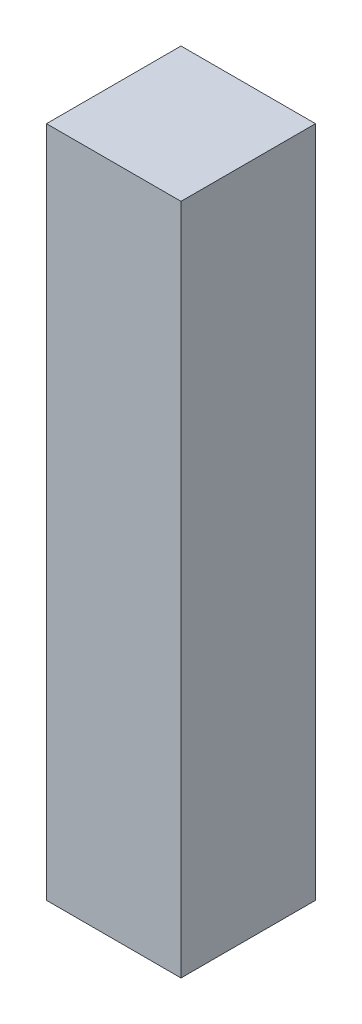
ISO-10303-21;
HEADER;
FILE_DESCRIPTION(('STEP AP214'),'2;1');
FILE_NAME('part.step','',(''),(''),'','','');
FILE_SCHEMA(('AUTOMOTIVE_DESIGN { 1 0 10303 214 1 1 1 1 }'));
ENDSEC;
DATA;
#1=APPLICATION_CONTEXT('core data for automotive mechanical design processes');
#2=APPLICATION_PROTOCOL_DEFINITION('international standard','automotive_design',2000,#1);
#3=PRODUCT_CONTEXT('',#1,'mechanical');
#4=PRODUCT('Part','Part','',(#3));
#5=PRODUCT_RELATED_PRODUCT_CATEGORY('part','',(#4));
#6=PRODUCT_DEFINITION_FORMATION('','',#4);
#7=PRODUCT_DEFINITION_CONTEXT('part definition',#1,'design');
#8=PRODUCT_DEFINITION('design','',#6,#7);
#9=PRODUCT_DEFINITION_SHAPE('','',#8);
#10=(LENGTH_UNIT() NAMED_UNIT(*) SI_UNIT(.MILLI.,.METRE.));
#11=(NAMED_UNIT(*) PLANE_ANGLE_UNIT() SI_UNIT($,.RADIAN.));
#12=(NAMED_UNIT(*) SI_UNIT($,.STERADIAN.) SOLID_ANGLE_UNIT());
#13=UNCERTAINTY_MEASURE_WITH_UNIT(LENGTH_MEASURE(1.E-05),#10,'distance_accuracy_value','');
#14=(GEOMETRIC_REPRESENTATION_CONTEXT(3) GLOBAL_UNCERTAINTY_ASSIGNED_CONTEXT((#13)) GLOBAL_UNIT_ASSIGNED_CONTEXT((#10,
#11,#12)) REPRESENTATION_CONTEXT('',''));
#15=CARTESIAN_POINT('',(0.,0.,0.));
#16=DIRECTION('',(0.,0.,1.));
#17=DIRECTION('',(1.,0.,0.));
#18=AXIS2_PLACEMENT_3D('',#15,#16,#17);
#19=CARTESIAN_POINT('',(-15.,150.,-15.));
#20=DIRECTION('',(1.,0.,0.));
#21=DIRECTION('',(0.,0.,-1.));
#22=AXIS2_PLACEMENT_3D('',#19,#20,#21);
#23=PLANE('',#22);
#24=DIRECTION('',(0.,0.,1.));
#25=VECTOR('',#24,1.);
#26=CARTESIAN_POINT('',(-15.,0.,-15.));
#27=LINE('',#26,#25);
#28=CARTESIAN_POINT('',(-15.,0.,-15.));
#29=VERTEX_POINT('',#28);
#30=CARTESIAN_POINT('',(-15.,0.,15.));
#31=VERTEX_POINT('',#30);
#32=EDGE_CURVE('E96',#29,#31,#27,.T.);
#33=ORIENTED_EDGE('',*,*,#32,.T.);
#34=DIRECTION('',(0.,-1.,0.));
#35=VECTOR('',#34,1.);
#36=CARTESIAN_POINT('',(-15.,150.,15.));
#37=LINE('',#36,#35);
#38=CARTESIAN_POINT('',(-15.,150.,15.));
#39=VERTEX_POINT('',#38);
#40=EDGE_CURVE('E11',#39,#31,#37,.T.);
#41=ORIENTED_EDGE('',*,*,#40,.F.);
#42=DIRECTION('',(0.,0.,1.));
#43=VECTOR('',#42,1.);
#44=CARTESIAN_POINT('',(-15.,150.,-15.));
#45=LINE('',#44,#43);
#46=CARTESIAN_POINT('',(-15.,150.,-15.));
#47=VERTEX_POINT('',#46);
#48=EDGE_CURVE('E84',#47,#39,#45,.T.);
#49=ORIENTED_EDGE('',*,*,#48,.F.);
#50=DIRECTION('',(0.,-1.,0.));
#51=VECTOR('',#50,1.);
#52=CARTESIAN_POINT('',(-15.,150.,-15.));
#53=LINE('',#52,#51);
#54=EDGE_CURVE('E92',#47,#29,#53,.T.);
#55=ORIENTED_EDGE('',*,*,#54,.T.);
#56=EDGE_LOOP('',(#33,#41,#49,#55));
#57=FACE_BOUND('',#56,.T.);
#58=ADVANCED_FACE('F33',(#57),#23,.F.);
#59=CARTESIAN_POINT('',(-15.,150.,15.));
#60=DIRECTION('',(0.,0.,-1.));
#61=DIRECTION('',(-1.,0.,0.));
#62=AXIS2_PLACEMENT_3D('',#59,#60,#61);
#63=PLANE('',#62);
#64=DIRECTION('',(1.,0.,0.));
#65=VECTOR('',#64,1.);
#66=CARTESIAN_POINT('',(-15.,0.,15.));
#67=LINE('',#66,#65);
#68=CARTESIAN_POINT('',(15.,0.,15.));
#69=VERTEX_POINT('',#68);
#70=EDGE_CURVE('E88',#31,#69,#67,.T.);
#71=ORIENTED_EDGE('',*,*,#70,.T.);
#72=DIRECTION('',(0.,-1.,0.));
#73=VECTOR('',#72,1.);
#74=CARTESIAN_POINT('',(15.,150.,15.));
#75=LINE('',#74,#73);
#76=CARTESIAN_POINT('',(15.,150.,15.));
#77=VERTEX_POINT('',#76);
#78=EDGE_CURVE('E41',#77,#69,#75,.T.);
#79=ORIENTED_EDGE('',*,*,#78,.F.);
#80=DIRECTION('',(1.,0.,0.));
#81=VECTOR('',#80,1.);
#82=CARTESIAN_POINT('',(-15.,150.,15.));
#83=LINE('',#82,#81);
#84=EDGE_CURVE('E79',#39,#77,#83,.T.);
#85=ORIENTED_EDGE('',*,*,#84,.F.);
#86=ORIENTED_EDGE('',*,*,#40,.T.);
#87=EDGE_LOOP('',(#71,#79,#85,#86));
#88=FACE_BOUND('',#87,.T.);
#89=ADVANCED_FACE('F87',(#88),#63,.F.);
#90=CARTESIAN_POINT('',(15.,150.,-15.));
#91=DIRECTION('',(-1.,0.,0.));
#92=DIRECTION('',(0.,0.,1.));
#93=AXIS2_PLACEMENT_3D('',#90,#91,#92);
#94=PLANE('',#93);
#95=DIRECTION('',(0.,0.,-1.));
#96=VECTOR('',#95,1.);
#97=CARTESIAN_POINT('',(15.,0.,-15.));
#98=LINE('',#97,#96);
#99=CARTESIAN_POINT('',(15.,0.,-15.));
#100=VERTEX_POINT('',#99);
#101=EDGE_CURVE('E66',#69,#100,#98,.T.);
#102=ORIENTED_EDGE('',*,*,#101,.T.);
#103=DIRECTION('',(0.,-1.,0.));
#104=VECTOR('',#103,1.);
#105=CARTESIAN_POINT('',(15.,150.,-15.));
#106=LINE('',#105,#104);
#107=CARTESIAN_POINT('',(15.,150.,-15.));
#108=VERTEX_POINT('',#107);
#109=EDGE_CURVE('E89',#108,#100,#106,.T.);
#110=ORIENTED_EDGE('',*,*,#109,.F.);
#111=DIRECTION('',(0.,0.,-1.));
#112=VECTOR('',#111,1.);
#113=CARTESIAN_POINT('',(15.,150.,-15.));
#114=LINE('',#113,#112);
#115=EDGE_CURVE('E82',#77,#108,#114,.T.);
#116=ORIENTED_EDGE('',*,*,#115,.F.);
#117=ORIENTED_EDGE('',*,*,#78,.T.);
#118=EDGE_LOOP('',(#102,#110,#116,#117));
#119=FACE_BOUND('',#118,.T.);
#120=ADVANCED_FACE('F90',(#119),#94,.F.);
#121=CARTESIAN_POINT('',(-15.,150.,-15.));
#122=DIRECTION('',(0.,0.,1.));
#123=DIRECTION('',(1.,0.,0.));
#124=AXIS2_PLACEMENT_3D('',#121,#122,#123);
#125=PLANE('',#124);
#126=DIRECTION('',(-1.,0.,0.));
#127=VECTOR('',#126,1.);
#128=CARTESIAN_POINT('',(-15.,0.,-15.));
#129=LINE('',#128,#127);
#130=EDGE_CURVE('E72',#100,#29,#129,.T.);
#131=ORIENTED_EDGE('',*,*,#130,.T.);
#132=ORIENTED_EDGE('',*,*,#54,.F.);
#133=DIRECTION('',(-1.,0.,0.));
#134=VECTOR('',#133,1.);
#135=CARTESIAN_POINT('',(-15.,150.,-15.));
#136=LINE('',#135,#134);
#137=EDGE_CURVE('E49',#108,#47,#136,.T.);
#138=ORIENTED_EDGE('',*,*,#137,.F.);
#139=ORIENTED_EDGE('',*,*,#109,.T.);
#140=EDGE_LOOP('',(#131,#132,#138,#139));
#141=FACE_BOUND('',#140,.T.);
#142=ADVANCED_FACE('F103',(#141),#125,.F.);
#143=CARTESIAN_POINT('',(0.,150.,0.));
#144=DIRECTION('',(0.,1.,0.));
#145=DIRECTION('',(0.,0.,1.));
#146=AXIS2_PLACEMENT_3D('',#143,#144,#145);
#147=PLANE('',#146);
#148=ORIENTED_EDGE('',*,*,#48,.T.);
#149=ORIENTED_EDGE('',*,*,#84,.T.);
#150=ORIENTED_EDGE('',*,*,#115,.T.);
#151=ORIENTED_EDGE('',*,*,#137,.T.);
#152=EDGE_LOOP('',(#148,#149,#150,#151));
#153=FACE_BOUND('',#152,.T.);
#154=ADVANCED_FACE('F80',(#153),#147,.T.);
#155=CARTESIAN_POINT('',(0.,0.,0.));
#156=DIRECTION('',(0.,1.,0.));
#157=DIRECTION('',(0.,0.,1.));
#158=AXIS2_PLACEMENT_3D('',#155,#156,#157);
#159=PLANE('',#158);
#160=ORIENTED_EDGE('',*,*,#32,.F.);
#161=ORIENTED_EDGE('',*,*,#130,.F.);
#162=ORIENTED_EDGE('',*,*,#101,.F.);
#163=ORIENTED_EDGE('',*,*,#70,.F.);
#164=EDGE_LOOP('',(#160,#161,#162,#163));
#165=FACE_BOUND('',#164,.T.);
#166=ADVANCED_FACE('F106',(#165),#159,.F.);
#167=CLOSED_SHELL('',(#58,#89,#120,#142,#154,#166));
#168=MANIFOLD_SOLID_BREP('B2',#167);
#169=ADVANCED_BREP_SHAPE_REPRESENTATION('',(#18,#168),#14);
#170=SHAPE_DEFINITION_REPRESENTATION(#9,#169);
ENDSEC;
END-ISO-10303-21;
